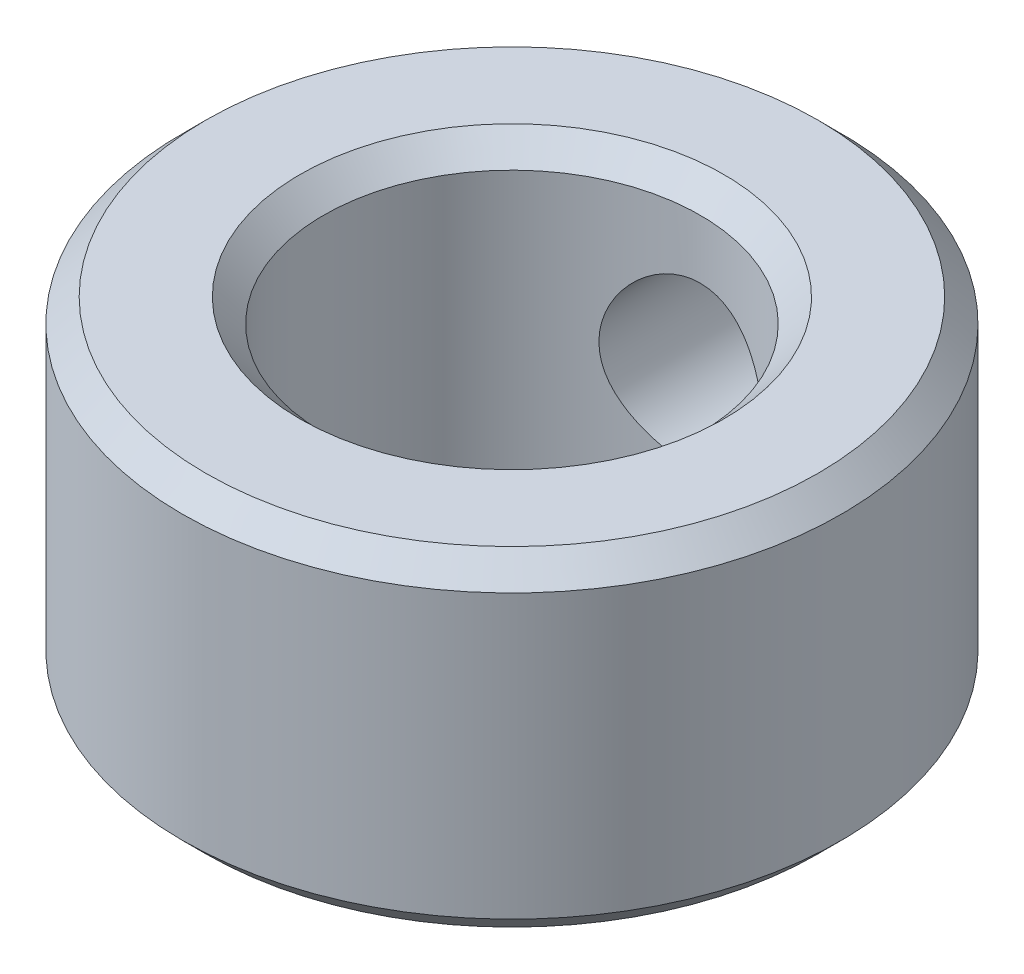
ISO-10303-21;
HEADER;
FILE_DESCRIPTION(('STEP AP214'),'2;1');
FILE_NAME('part.step','',(''),(''),'','','');
FILE_SCHEMA(('AUTOMOTIVE_DESIGN { 1 0 10303 214 1 1 1 1 }'));
ENDSEC;
DATA;
#1=APPLICATION_CONTEXT('core data for automotive mechanical design processes');
#2=APPLICATION_PROTOCOL_DEFINITION('international standard','automotive_design',2000,#1);
#3=PRODUCT_CONTEXT('',#1,'mechanical');
#4=PRODUCT('Part','Part','',(#3));
#5=PRODUCT_RELATED_PRODUCT_CATEGORY('part','',(#4));
#6=PRODUCT_DEFINITION_FORMATION('','',#4);
#7=PRODUCT_DEFINITION_CONTEXT('part definition',#1,'design');
#8=PRODUCT_DEFINITION('design','',#6,#7);
#9=PRODUCT_DEFINITION_SHAPE('','',#8);
#10=(LENGTH_UNIT() NAMED_UNIT(*) SI_UNIT(.MILLI.,.METRE.));
#11=(NAMED_UNIT(*) PLANE_ANGLE_UNIT() SI_UNIT($,.RADIAN.));
#12=(NAMED_UNIT(*) SI_UNIT($,.STERADIAN.) SOLID_ANGLE_UNIT());
#13=UNCERTAINTY_MEASURE_WITH_UNIT(LENGTH_MEASURE(1.E-05),#10,'distance_accuracy_value','');
#14=(GEOMETRIC_REPRESENTATION_CONTEXT(3) GLOBAL_UNCERTAINTY_ASSIGNED_CONTEXT((#13)) GLOBAL_UNIT_ASSIGNED_CONTEXT((#10,
#11,#12)) REPRESENTATION_CONTEXT('',''));
#15=CARTESIAN_POINT('',(0.,0.,0.));
#16=DIRECTION('',(0.,0.,1.));
#17=DIRECTION('',(1.,0.,0.));
#18=AXIS2_PLACEMENT_3D('',#15,#16,#17);
#19=CARTESIAN_POINT('',(0.,7.,0.));
#20=DIRECTION('',(0.,1.,0.));
#21=DIRECTION('',(0.,0.,1.));
#22=AXIS2_PLACEMENT_3D('',#19,#20,#21);
#23=PLANE('',#22);
#24=CARTESIAN_POINT('',(0.,7.,0.));
#25=DIRECTION('',(0.,1.,0.));
#26=DIRECTION('',(0.,0.,1.));
#27=AXIS2_PLACEMENT_3D('',#24,#25,#26);
#28=CIRCLE('',#27,4.5);
#29=CARTESIAN_POINT('',(0.,7.,4.5));
#30=VERTEX_POINT('',#29);
#31=EDGE_CURVE('E10',#30,#30,#28,.F.);
#32=ORIENTED_EDGE('',*,*,#31,.T.);
#33=EDGE_LOOP('',(#32));
#34=FACE_BOUND('',#33,.T.);
#35=CARTESIAN_POINT('',(0.,7.,0.));
#36=DIRECTION('',(0.,1.,0.));
#37=DIRECTION('',(0.,0.,1.));
#38=AXIS2_PLACEMENT_3D('',#35,#36,#37);
#39=CIRCLE('',#38,6.5);
#40=CARTESIAN_POINT('',(0.,7.,6.5));
#41=VERTEX_POINT('',#40);
#42=EDGE_CURVE('E47',#41,#41,#39,.T.);
#43=ORIENTED_EDGE('',*,*,#42,.T.);
#44=EDGE_LOOP('',(#43));
#45=FACE_BOUND('',#44,.T.);
#46=ADVANCED_FACE('F38',(#34,#45),#23,.T.);
#47=CARTESIAN_POINT('',(0.,0.,0.));
#48=DIRECTION('',(0.,1.,0.));
#49=DIRECTION('',(0.,0.,1.));
#50=AXIS2_PLACEMENT_3D('',#47,#48,#49);
#51=PLANE('',#50);
#52=CARTESIAN_POINT('',(0.,0.,0.));
#53=DIRECTION('',(0.,1.,0.));
#54=DIRECTION('',(0.,0.,1.));
#55=AXIS2_PLACEMENT_3D('',#52,#53,#54);
#56=CIRCLE('',#55,4.5);
#57=CARTESIAN_POINT('',(0.,0.,4.5));
#58=VERTEX_POINT('',#57);
#59=EDGE_CURVE('E71',#58,#58,#56,.T.);
#60=ORIENTED_EDGE('',*,*,#59,.T.);
#61=EDGE_LOOP('',(#60));
#62=FACE_BOUND('',#61,.T.);
#63=CARTESIAN_POINT('',(0.,0.,0.));
#64=DIRECTION('',(0.,1.,0.));
#65=DIRECTION('',(0.,0.,1.));
#66=AXIS2_PLACEMENT_3D('',#63,#64,#65);
#67=CIRCLE('',#66,6.5);
#68=CARTESIAN_POINT('',(0.,0.,6.5));
#69=VERTEX_POINT('',#68);
#70=EDGE_CURVE('E75',#69,#69,#67,.F.);
#71=ORIENTED_EDGE('',*,*,#70,.T.);
#72=EDGE_LOOP('',(#71));
#73=FACE_BOUND('',#72,.T.);
#74=ADVANCED_FACE('F109',(#62,#73),#51,.F.);
#75=CARTESIAN_POINT('',(0.,7.,0.));
#76=DIRECTION('',(0.,-1.,0.));
#77=DIRECTION('',(0.,0.,-1.));
#78=AXIS2_PLACEMENT_3D('',#75,#76,#77);
#79=CYLINDRICAL_SURFACE('',#78,7.);
#80=CARTESIAN_POINT('',(0.,0.499999999999996,0.));
#81=DIRECTION('',(0.,1.,0.));
#82=DIRECTION('',(0.,0.,1.));
#83=AXIS2_PLACEMENT_3D('',#80,#81,#82);
#84=CIRCLE('',#83,7.);
#85=CARTESIAN_POINT('',(0.,0.499999999999996,7.));
#86=VERTEX_POINT('',#85);
#87=EDGE_CURVE('E52',#86,#86,#84,.T.);
#88=ORIENTED_EDGE('',*,*,#87,.T.);
#89=EDGE_LOOP('',(#88));
#90=FACE_BOUND('',#89,.T.);
#91=CARTESIAN_POINT('',(0.,6.5,0.));
#92=DIRECTION('',(0.,1.,0.));
#93=DIRECTION('',(0.,0.,1.));
#94=AXIS2_PLACEMENT_3D('',#91,#92,#93);
#95=CIRCLE('',#94,7.);
#96=CARTESIAN_POINT('',(0.,6.5,7.));
#97=VERTEX_POINT('',#96);
#98=EDGE_CURVE('E57',#97,#97,#95,.F.);
#99=ORIENTED_EDGE('',*,*,#98,.T.);
#100=EDGE_LOOP('',(#99));
#101=FACE_BOUND('',#100,.T.);
#102=CARTESIAN_POINT('',(1.75,3.5,-6.77772085586298));
#103=CARTESIAN_POINT('',(1.74999725501424,3.40336447435277,-6.77772270059716));
#104=CARTESIAN_POINT('',(1.74196837184811,3.3066985709254,-6.77981014209739));
#105=CARTESIAN_POINT('',(1.7101161878249,3.11614269527817,-6.78791303395274));
#106=CARTESIAN_POINT('',(1.68628369471954,3.02225437187217,-6.79393077035269));
#107=CARTESIAN_POINT('',(1.62364383974236,2.84003752326907,-6.80917107217177));
#108=CARTESIAN_POINT('',(1.58485580949813,2.75170199123003,-6.81838949883286));
#109=CARTESIAN_POINT('',(1.49346479888299,2.58278240322206,-6.83898734420165));
#110=CARTESIAN_POINT('',(1.44086123199248,2.50219867654384,-6.85036685464951));
#111=CARTESIAN_POINT('',(1.32209589911831,2.34929684831646,-6.87428501448928));
#112=CARTESIAN_POINT('',(1.25568582139283,2.27717447975497,-6.88684218336121));
#113=CARTESIAN_POINT('',(1.11172744487046,2.14496702394776,-6.91154012860708));
#114=CARTESIAN_POINT('',(1.03417810592621,2.08488306206478,-6.92368086596473));
#115=CARTESIAN_POINT('',(0.868801640755267,1.97765717265811,-6.94638290864407));
#116=CARTESIAN_POINT('',(0.780846203336583,1.93070752828697,-6.95691981180415));
#117=CARTESIAN_POINT('',(0.597984229004933,1.85233324909284,-6.97501568348189));
#118=CARTESIAN_POINT('',(0.503078720054357,1.82090632365914,-6.98257509134041));
#119=CARTESIAN_POINT('',(0.311051131127912,1.77509651579499,-6.99373331193726));
#120=CARTESIAN_POINT('',(0.214012903684282,1.76038124897139,-6.9974092569102));
#121=CARTESIAN_POINT('',(0.0187801734839377,1.74736913450711,-7.00065515875109));
#122=CARTESIAN_POINT('',(-0.0794141561766487,1.74906985945328,-7.00022572267693));
#123=CARTESIAN_POINT('',(-0.271866432551679,1.7686023951751,-6.99536666467474));
#124=CARTESIAN_POINT('',(-0.366163377301868,1.7860754275377,-6.99102601638612));
#125=CARTESIAN_POINT('',(-0.550441932973952,1.83607988903395,-6.97893585567398));
#126=CARTESIAN_POINT('',(-0.640423313898267,1.86861211976419,-6.97118616178909));
#127=CARTESIAN_POINT('',(-0.814461731128162,1.94810179948095,-6.95301256790627));
#128=CARTESIAN_POINT('',(-0.898457892091384,1.99518693126322,-6.94256513786537));
#129=CARTESIAN_POINT('',(-1.05748233909586,2.10234897538138,-6.92012932666754));
#130=CARTESIAN_POINT('',(-1.13250906139964,2.16242814799243,-6.90814067756743));
#131=CARTESIAN_POINT('',(-1.27360456139867,2.29579611938766,-6.88354599638664));
#132=CARTESIAN_POINT('',(-1.3393759383816,2.36939842464344,-6.87093203668142));
#133=CARTESIAN_POINT('',(-1.45770865793528,2.52671998147818,-6.84680530461695));
#134=CARTESIAN_POINT('',(-1.51026938308053,2.6104397056437,-6.83529258374179));
#135=CARTESIAN_POINT('',(-1.60087922578955,2.78620302390428,-6.81464347782154));
#136=CARTESIAN_POINT('',(-1.63885674219836,2.87828501121924,-6.80551888608004));
#137=CARTESIAN_POINT('',(-1.6986998361136,3.06780982765352,-6.7908304809797));
#138=CARTESIAN_POINT('',(-1.72056886146759,3.1652515047882,-6.78526590567153));
#139=CARTESIAN_POINT('',(-1.74708074706562,3.35997165106619,-6.77848749227399));
#140=CARTESIAN_POINT('',(-1.75216333174374,3.45718645533074,-6.77716262365554));
#141=CARTESIAN_POINT('',(-1.74616189336088,3.65107535560471,-6.77871140436728));
#142=CARTESIAN_POINT('',(-1.73507935849416,3.74774950056587,-6.78158466720886));
#143=CARTESIAN_POINT('',(-1.69744782475636,3.9361799854683,-6.79109957368192));
#144=CARTESIAN_POINT('',(-1.67115484779722,4.02799090859959,-6.79767879164063));
#145=CARTESIAN_POINT('',(-1.60413265716943,4.20590202049618,-6.81380502789674));
#146=CARTESIAN_POINT('',(-1.56340173339878,4.29200153133874,-6.82335239774029));
#147=CARTESIAN_POINT('',(-1.46773946755559,4.45790889450715,-6.84457295965284));
#148=CARTESIAN_POINT('',(-1.41254522768494,4.53756018803017,-6.85628418024649));
#149=CARTESIAN_POINT('',(-1.2898555126353,4.68663185396095,-6.88041958150201));
#150=CARTESIAN_POINT('',(-1.22235801590952,4.75605054165505,-6.89284387909929));
#151=CARTESIAN_POINT('',(-1.07495976172327,4.88446772979967,-6.91738182122124));
#152=CARTESIAN_POINT('',(-0.994790916930287,4.94316204378417,-6.92947991443285));
#153=CARTESIAN_POINT('',(-0.825479694715681,5.04625510686587,-6.95168051629614));
#154=CARTESIAN_POINT('',(-0.736337785675784,5.09065460162574,-6.96178312902772));
#155=CARTESIAN_POINT('',(-0.552226853029407,5.16351222416955,-6.9787908101682));
#156=CARTESIAN_POINT('',(-0.457305416798791,5.19208499906534,-6.98571881015687));
#157=CARTESIAN_POINT('',(-0.263812080557913,5.23282223422589,-6.99569705377052));
#158=CARTESIAN_POINT('',(-0.165240888822176,5.24498986111734,-6.99874804575386));
#159=CARTESIAN_POINT('',(0.0298961712758217,5.25239328175718,-7.00059796465419));
#160=CARTESIAN_POINT('',(0.126444197190559,5.24807799091693,-6.99950963040014));
#161=CARTESIAN_POINT('',(0.317393118725795,5.22366630223492,-6.99345318800491));
#162=CARTESIAN_POINT('',(0.411794078116552,5.20357037372707,-6.98848519524916));
#163=CARTESIAN_POINT('',(0.595299312378429,5.14840861540088,-6.97524507494435));
#164=CARTESIAN_POINT('',(0.684429365516784,5.11342395669941,-6.96699087879666));
#165=CARTESIAN_POINT('',(0.855604842822571,5.02955148671618,-6.94804755598422));
#166=CARTESIAN_POINT('',(0.937649372213841,4.98066192282826,-6.93735812241038));
#167=CARTESIAN_POINT('',(1.09445337474182,4.86899834050512,-6.91437686942333));
#168=CARTESIAN_POINT('',(1.16899122952602,4.80591974991209,-6.9020527965482));
#169=CARTESIAN_POINT('',(1.3065762854747,4.66826000904585,-6.87733635843173));
#170=CARTESIAN_POINT('',(1.36962056886933,4.59367594682866,-6.86494397666973));
#171=CARTESIAN_POINT('',(1.48358354633865,4.43344752514767,-6.84123082755959));
#172=CARTESIAN_POINT('',(1.53425408403146,4.3476227840279,-6.82993436527298));
#173=CARTESIAN_POINT('',(1.62037206907741,4.16840289263527,-6.81001922213577));
#174=CARTESIAN_POINT('',(1.65583059207951,4.0750133093132,-6.8013985943173));
#175=CARTESIAN_POINT('',(1.70523942498952,3.90149022930325,-6.78915840294621));
#176=CARTESIAN_POINT('',(1.72198804854191,3.82218696232824,-6.78490160250957));
#177=CARTESIAN_POINT('',(1.74436901200322,3.66192947925006,-6.77918217524751));
#178=CARTESIAN_POINT('',(1.75000230015132,3.58097540457114,-6.77771931007435));
#179=CARTESIAN_POINT('',(1.75,3.5,-6.77772085586298));
#180=B_SPLINE_CURVE_WITH_KNOTS('',3,(#102,#103,#104,#105,#106,#107,#108,#109,#110,#111,#112,
#113,#114,#115,#116,#117,#118,#119,#120,#121,#122,#123,#124,#125,#126,#127,#128,#129,#130,#131,
#132,#133,#134,#135,#136,#137,#138,#139,#140,#141,#142,#143,#144,#145,#146,#147,#148,#149,#150,
#151,#152,#153,#154,#155,#156,#157,#158,#159,#160,#161,#162,#163,#164,#165,#166,#167,#168,#169,
#170,#171,#172,#173,#174,#175,#176,#177,#178,#179),.UNSPECIFIED.,.T.,.F.,(4,2,2,2,2,2,2,2,2,2,2,
2,2,2,2,2,2,2,2,2,2,2,2,2,2,2,2,2,2,2,2,2,2,2,2,2,2,2,4),(0.,0.289609209215296,
0.579387019000067,0.868791509016215,1.15820828728835,1.45336767935083,1.74855465035907,
2.04786047478544,2.34712211892965,2.64032125696743,2.93347704066214,3.22012783882263,
3.5067938970735,3.79605011978111,4.08535669828239,4.38249326600338,4.67964371839862,
4.97823502405882,5.27676240090683,5.56740502333202,5.85802089028661,6.14388183506445,
6.42977664994992,6.7212799210141,7.01283113219531,7.31167731675723,7.61050791003687,
7.90714450964851,8.20372384236327,8.4922841228922,8.78083582163887,9.06783413591798,
9.35486864016651,9.6487796760745,9.94276522095856,10.2422353409927,10.5414870495663,
10.7841847902413,11.0268618256966),.UNSPECIFIED.);
#181=CARTESIAN_POINT('',(1.75,3.5,-6.77772085586298));
#182=VERTEX_POINT('',#181);
#183=EDGE_CURVE('E79',#182,#182,#180,.T.);
#184=ORIENTED_EDGE('',*,*,#183,.F.);
#185=EDGE_LOOP('',(#184));
#186=FACE_BOUND('',#185,.T.);
#187=ADVANCED_FACE('F105',(#90,#101,#186),#79,.T.);
#188=CARTESIAN_POINT('',(0.,7.,0.));
#189=DIRECTION('',(0.,-1.,0.));
#190=DIRECTION('',(0.,0.,-1.));
#191=AXIS2_PLACEMENT_3D('',#188,#189,#190);
#192=CYLINDRICAL_SURFACE('',#191,4.);
#193=CARTESIAN_POINT('',(0.,0.5,0.));
#194=DIRECTION('',(0.,1.,0.));
#195=DIRECTION('',(0.,0.,1.));
#196=AXIS2_PLACEMENT_3D('',#193,#194,#195);
#197=CIRCLE('',#196,4.);
#198=CARTESIAN_POINT('',(0.,0.5,4.));
#199=VERTEX_POINT('',#198);
#200=EDGE_CURVE('E63',#199,#199,#197,.F.);
#201=ORIENTED_EDGE('',*,*,#200,.T.);
#202=EDGE_LOOP('',(#201));
#203=FACE_BOUND('',#202,.T.);
#204=CARTESIAN_POINT('',(0.,6.5,0.));
#205=DIRECTION('',(0.,1.,0.));
#206=DIRECTION('',(0.,0.,1.));
#207=AXIS2_PLACEMENT_3D('',#204,#205,#206);
#208=CIRCLE('',#207,4.);
#209=CARTESIAN_POINT('',(0.,6.5,4.));
#210=VERTEX_POINT('',#209);
#211=EDGE_CURVE('E67',#210,#210,#208,.T.);
#212=ORIENTED_EDGE('',*,*,#211,.T.);
#213=EDGE_LOOP('',(#212));
#214=FACE_BOUND('',#213,.T.);
#215=CARTESIAN_POINT('',(1.75,3.5,-3.59687364248454));
#216=CARTESIAN_POINT('',(1.74999577608997,3.40716289442287,-3.59687819454889));
#217=CARTESIAN_POINT('',(1.74256561547484,3.31417157119662,-3.60051987471824));
#218=CARTESIAN_POINT('',(1.71316453984274,3.13091468094083,-3.6145982134691));
#219=CARTESIAN_POINT('',(1.69115606723878,3.04065678566668,-3.62505242179371));
#220=CARTESIAN_POINT('',(1.63363928523817,2.8658460553758,-3.65132964408605));
#221=CARTESIAN_POINT('',(1.59818984646979,2.78127020835369,-3.66712921364487));
#222=CARTESIAN_POINT('',(1.5149738058054,2.61928861684967,-3.70228135238792));
#223=CARTESIAN_POINT('',(1.46720924305884,2.54188168821309,-3.721633333208));
#224=CARTESIAN_POINT('',(1.3572089262902,2.39106879758652,-3.76319624526349));
#225=CARTESIAN_POINT('',(1.29425610425353,2.31821397926124,-3.7855102256129));
#226=CARTESIAN_POINT('',(1.15716879759801,2.18368355010947,-3.82964019631965));
#227=CARTESIAN_POINT('',(1.08302975907306,2.12201251481657,-3.85145597967745));
#228=CARTESIAN_POINT('',(0.921247017509311,2.00868513656312,-3.89340614210936));
#229=CARTESIAN_POINT('',(0.833121556719551,1.95766255804667,-3.91340694775095));
#230=CARTESIAN_POINT('',(0.648503189012278,1.87140885146063,-3.94819518757295));
#231=CARTESIAN_POINT('',(0.552014385765683,1.83617003048588,-3.96298516072889));
#232=CARTESIAN_POINT('',(0.359208082434877,1.78452419393086,-3.98495203301356));
#233=CARTESIAN_POINT('',(0.263190827254633,1.76716303885218,-3.9925129112926));
#234=CARTESIAN_POINT('',(0.0693287873971894,1.74866837810413,-4.00057352136833));
#235=CARTESIAN_POINT('',(-0.028515154942043,1.74752756922047,-4.00107643101556));
#236=CARTESIAN_POINT('',(-0.216261746914354,1.76103640433386,-3.99518046503913));
#237=CARTESIAN_POINT('',(-0.306257390419992,1.77463365916818,-3.98924155475604));
#238=CARTESIAN_POINT('',(-0.482538817916277,1.8154102498973,-3.9717760022467));
#239=CARTESIAN_POINT('',(-0.568824326867455,1.84259059085383,-3.96024894653523));
#240=CARTESIAN_POINT('',(-0.736835262665254,1.91006356226138,-3.93248536583386));
#241=CARTESIAN_POINT('',(-0.818470815688341,1.95055028773285,-3.91617954122424));
#242=CARTESIAN_POINT('',(-0.974004107270158,2.04328377276071,-3.8804244411406));
#243=CARTESIAN_POINT('',(-1.0478990259724,2.09553479628501,-3.86097402663296));
#244=CARTESIAN_POINT('',(-1.19187174309814,2.21495328761213,-3.81909482718667));
#245=CARTESIAN_POINT('',(-1.26122407671226,2.28295653631973,-3.79655202552094));
#246=CARTESIAN_POINT('',(-1.38787377204875,2.4296255760914,-3.75210882272334));
#247=CARTESIAN_POINT('',(-1.44516549029934,2.50829633057317,-3.73020872643631));
#248=CARTESIAN_POINT('',(-1.54820801514461,2.67794260058652,-3.6886672154947));
#249=CARTESIAN_POINT('',(-1.59341626667799,2.76928038179595,-3.66914851821635));
#250=CARTESIAN_POINT('',(-1.6675068498565,2.95935009754533,-3.63608114430028));
#251=CARTESIAN_POINT('',(-1.69640223530589,3.05807604809934,-3.62252769609899));
#252=CARTESIAN_POINT('',(-1.73509908818066,3.25283070077687,-3.60414514481282));
#253=CARTESIAN_POINT('',(-1.74608539056461,3.34857190324582,-3.59877635513874));
#254=CARTESIAN_POINT('',(-1.75216137559478,3.54066000344493,-3.59582367253245));
#255=CARTESIAN_POINT('',(-1.74725757014364,3.63700663691235,-3.59823659058768));
#256=CARTESIAN_POINT('',(-1.72277634072846,3.82006311438135,-3.6100134188485));
#257=CARTESIAN_POINT('',(-1.70430774610854,3.9069596428181,-3.61885157987097));
#258=CARTESIAN_POINT('',(-1.65473120013592,4.07632940915253,-3.64178595157544));
#259=CARTESIAN_POINT('',(-1.62362008519095,4.158801534061,-3.65588347825874));
#260=CARTESIAN_POINT('',(-1.54812910706366,4.32107087084074,-3.68850278164019));
#261=CARTESIAN_POINT('',(-1.50322324911612,4.4005884501779,-3.70719265812915));
#262=CARTESIAN_POINT('',(-1.40192319593043,4.55136547846522,-3.74667372986852));
#263=CARTESIAN_POINT('',(-1.3455236955994,4.62262109004358,-3.76746589322541));
#264=CARTESIAN_POINT('',(-1.21676814254937,4.76164578778334,-3.81110220456349));
#265=CARTESIAN_POINT('',(-1.14342436340306,4.82849960194522,-3.83396006534231));
#266=CARTESIAN_POINT('',(-0.98605783740305,4.94914428383617,-3.87741501019437));
#267=CARTESIAN_POINT('',(-0.902033783821306,5.00293355077419,-3.89801181705276));
#268=CARTESIAN_POINT('',(-0.724645877674747,5.09608462508259,-3.93486208154196));
#269=CARTESIAN_POINT('',(-0.631221708208403,5.13534455814212,-3.95108466146121));
#270=CARTESIAN_POINT('',(-0.438194594445851,5.19727435093143,-3.97711493289083));
#271=CARTESIAN_POINT('',(-0.33859579409405,5.21995520928519,-3.9869268767829));
#272=CARTESIAN_POINT('',(-0.14418236091835,5.24659696219071,-3.99849624227039));
#273=CARTESIAN_POINT('',(-0.0495759598119035,5.2518444556949,-4.0008069362502));
#274=CARTESIAN_POINT('',(0.139156361955344,5.24700897845425,-3.99869150768194));
#275=CARTESIAN_POINT('',(0.233282378860698,5.23692921003997,-3.99426679236524));
#276=CARTESIAN_POINT('',(0.414279177098123,5.20264619700566,-3.97948251456916));
#277=CARTESIAN_POINT('',(0.501288619826494,5.17905438139825,-3.96938021562305));
#278=CARTESIAN_POINT('',(0.670057216941629,5.11911919383194,-3.94440199855857));
#279=CARTESIAN_POINT('',(0.751815426911258,5.08277353569061,-3.92952522463539));
#280=CARTESIAN_POINT('',(0.911900823969187,4.99652265103245,-3.89556659626993));
#281=CARTESIAN_POINT('',(0.989899416247832,4.94607267885892,-3.87632336705539));
#282=CARTESIAN_POINT('',(1.13666500542713,4.83380569373778,-3.83585685446722));
#283=CARTESIAN_POINT('',(1.20542817976969,4.77198399894363,-3.81463275733085));
#284=CARTESIAN_POINT('',(1.33723149580577,4.6332043029573,-3.77054409773764));
#285=CARTESIAN_POINT('',(1.3994380988651,4.55545252420228,-3.74767758883224));
#286=CARTESIAN_POINT('',(1.5100873956313,4.38996809699007,-3.70448058254829));
#287=CARTESIAN_POINT('',(1.55852177306422,4.30222946261369,-3.68415162159098));
#288=CARTESIAN_POINT('',(1.64003866605434,4.11876002969818,-3.64859760015999));
#289=CARTESIAN_POINT('',(1.67310197748509,4.02301940888121,-3.6333789308777));
#290=CARTESIAN_POINT('',(1.72221188407887,3.82659470551519,-3.61036620682713));
#291=CARTESIAN_POINT('',(1.73831556951834,3.7259284095019,-3.60254725186993));
#292=CARTESIAN_POINT('',(1.74703572559822,3.60393550397992,-3.59831407456883));
#293=CARTESIAN_POINT('',(1.74814627318149,3.58316991294979,-3.59777502346882));
#294=CARTESIAN_POINT('',(1.74962889188203,3.5416054638579,-3.59705429337009));
#295=CARTESIAN_POINT('',(1.75000094666058,3.5208066050703,-3.59687262227818));
#296=CARTESIAN_POINT('',(1.75,3.5,-3.59687364248454));
#297=B_SPLINE_CURVE_WITH_KNOTS('',3,(#215,#216,#217,#218,#219,#220,#221,#222,#223,#224,#225,
#226,#227,#228,#229,#230,#231,#232,#233,#234,#235,#236,#237,#238,#239,#240,#241,#242,#243,#244,
#245,#246,#247,#248,#249,#250,#251,#252,#253,#254,#255,#256,#257,#258,#259,#260,#261,#262,#263,
#264,#265,#266,#267,#268,#269,#270,#271,#272,#273,#274,#275,#276,#277,#278,#279,#280,#281,#282,
#283,#284,#285,#286,#287,#288,#289,#290,#291,#292,#293,#294,#295,#296),.UNSPECIFIED.,.T.,.F.,(4,
2,2,2,2,2,2,2,2,2,2,2,2,2,2,2,2,2,2,2,2,2,2,2,2,2,2,2,2,2,2,2,2,2,2,2,2,2,2,2,4),(0.,
0.278423709089657,0.557567515667148,0.83550255411435,1.11339160134649,1.40862253901942,
1.703973991051,2.01370508313311,2.32328504950115,2.6153188205415,2.90722109914898,
3.17957432675714,3.45194770975124,3.72848484888748,4.00512238068054,4.30294103546421,
4.60089873899835,4.91057566441317,5.22000442909255,5.50798165433932,5.79584087897396,
6.06247089944839,6.32916768102552,6.60765996633827,6.88628108699589,7.19039073128141,
7.49453761916006,7.80077838726026,8.10681580917881,8.38969680616703,8.67251870884305,
8.94345335784295,9.21443659790207,9.49782974545364,9.78133983087841,10.0864214236492,
10.3916868487401,10.6973326446402,11.0019462404003,11.0643450405093,11.12674522114),.UNSPECIFIED.);
#298=CARTESIAN_POINT('',(1.75,3.5,-3.59687364248454));
#299=VERTEX_POINT('',#298);
#300=EDGE_CURVE('E88',#299,#299,#297,.T.);
#301=ORIENTED_EDGE('',*,*,#300,.T.);
#302=EDGE_LOOP('',(#301));
#303=FACE_BOUND('',#302,.T.);
#304=ADVANCED_FACE('F100',(#203,#214,#303),#192,.F.);
#305=CARTESIAN_POINT('',(0.,3.5,-7.001));
#306=DIRECTION('',(0.,0.,1.));
#307=DIRECTION('',(1.,0.,0.));
#308=AXIS2_PLACEMENT_3D('',#305,#306,#307);
#309=CYLINDRICAL_SURFACE('',#308,1.75);
#310=ORIENTED_EDGE('',*,*,#300,.F.);
#311=EDGE_LOOP('',(#310));
#312=FACE_BOUND('',#311,.T.);
#313=ORIENTED_EDGE('',*,*,#183,.T.);
#314=EDGE_LOOP('',(#313));
#315=FACE_BOUND('',#314,.T.);
#316=ADVANCED_FACE('F93',(#312,#315),#309,.F.);
#317=CARTESIAN_POINT('',(0.,0.,0.));
#318=DIRECTION('',(0.,-1.,0.));
#319=DIRECTION('',(0.,0.,-1.));
#320=AXIS2_PLACEMENT_3D('',#317,#318,#319);
#321=CONICAL_SURFACE('',#320,4.5,0.785398163397448);
#322=ORIENTED_EDGE('',*,*,#200,.F.);
#323=EDGE_LOOP('',(#322));
#324=FACE_BOUND('',#323,.T.);
#325=ORIENTED_EDGE('',*,*,#59,.F.);
#326=EDGE_LOOP('',(#325));
#327=FACE_BOUND('',#326,.T.);
#328=ADVANCED_FACE('F99',(#324,#327),#321,.F.);
#329=CARTESIAN_POINT('',(0.,0.499999999999996,0.));
#330=DIRECTION('',(0.,1.,0.));
#331=DIRECTION('',(0.,0.,1.));
#332=AXIS2_PLACEMENT_3D('',#329,#330,#331);
#333=CONICAL_SURFACE('',#332,7.,0.785398163397452);
#334=ORIENTED_EDGE('',*,*,#70,.F.);
#335=EDGE_LOOP('',(#334));
#336=FACE_BOUND('',#335,.T.);
#337=ORIENTED_EDGE('',*,*,#87,.F.);
#338=EDGE_LOOP('',(#337));
#339=FACE_BOUND('',#338,.T.);
#340=ADVANCED_FACE('F122',(#336,#339),#333,.T.);
#341=CARTESIAN_POINT('',(0.,6.5,0.));
#342=DIRECTION('',(0.,1.,0.));
#343=DIRECTION('',(0.,0.,1.));
#344=AXIS2_PLACEMENT_3D('',#341,#342,#343);
#345=CONICAL_SURFACE('',#344,4.,0.78539816339745);
#346=ORIENTED_EDGE('',*,*,#31,.F.);
#347=EDGE_LOOP('',(#346));
#348=FACE_BOUND('',#347,.T.);
#349=ORIENTED_EDGE('',*,*,#211,.F.);
#350=EDGE_LOOP('',(#349));
#351=FACE_BOUND('',#350,.T.);
#352=ADVANCED_FACE('F128',(#348,#351),#345,.F.);
#353=CARTESIAN_POINT('',(0.,7.,0.));
#354=DIRECTION('',(0.,-1.,0.));
#355=DIRECTION('',(0.,0.,-1.));
#356=AXIS2_PLACEMENT_3D('',#353,#354,#355);
#357=CONICAL_SURFACE('',#356,6.5,0.785398163397445);
#358=ORIENTED_EDGE('',*,*,#98,.F.);
#359=EDGE_LOOP('',(#358));
#360=FACE_BOUND('',#359,.T.);
#361=ORIENTED_EDGE('',*,*,#42,.F.);
#362=EDGE_LOOP('',(#361));
#363=FACE_BOUND('',#362,.T.);
#364=ADVANCED_FACE('F41',(#360,#363),#357,.T.);
#365=CLOSED_SHELL('',(#46,#74,#187,#304,#316,#328,#340,#352,#364));
#366=MANIFOLD_SOLID_BREP('B2',#365);
#367=ADVANCED_BREP_SHAPE_REPRESENTATION('',(#18,#366),#14);
#368=SHAPE_DEFINITION_REPRESENTATION(#9,#367);
ENDSEC;
END-ISO-10303-21;
